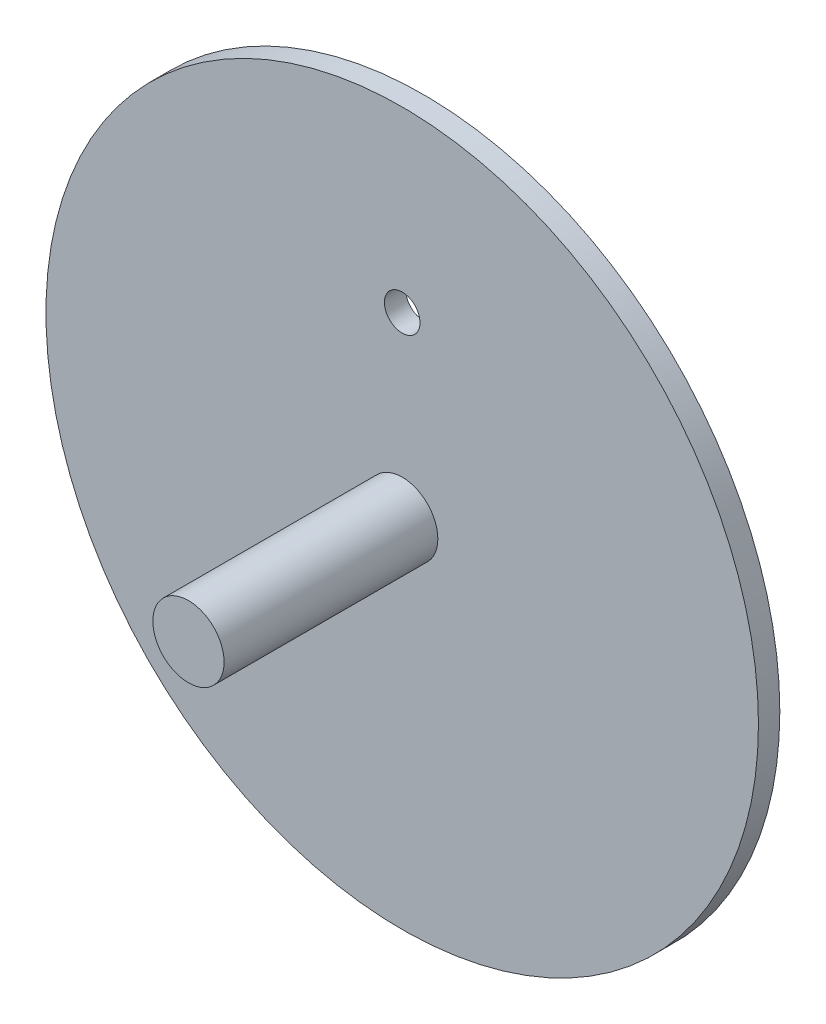
ISO-10303-21;
HEADER;
FILE_DESCRIPTION(('STEP AP214'),'2;1');
FILE_NAME('part.step','',(''),(''),'','','');
FILE_SCHEMA(('AUTOMOTIVE_DESIGN { 1 0 10303 214 1 1 1 1 }'));
ENDSEC;
DATA;
#1=APPLICATION_CONTEXT('core data for automotive mechanical design processes');
#2=APPLICATION_PROTOCOL_DEFINITION('international standard','automotive_design',2000,#1);
#3=PRODUCT_CONTEXT('',#1,'mechanical');
#4=PRODUCT('Part','Part','',(#3));
#5=PRODUCT_RELATED_PRODUCT_CATEGORY('part','',(#4));
#6=PRODUCT_DEFINITION_FORMATION('','',#4);
#7=PRODUCT_DEFINITION_CONTEXT('part definition',#1,'design');
#8=PRODUCT_DEFINITION('design','',#6,#7);
#9=PRODUCT_DEFINITION_SHAPE('','',#8);
#10=(LENGTH_UNIT() NAMED_UNIT(*) SI_UNIT(.MILLI.,.METRE.));
#11=(NAMED_UNIT(*) PLANE_ANGLE_UNIT() SI_UNIT($,.RADIAN.));
#12=(NAMED_UNIT(*) SI_UNIT($,.STERADIAN.) SOLID_ANGLE_UNIT());
#13=UNCERTAINTY_MEASURE_WITH_UNIT(LENGTH_MEASURE(1.E-05),#10,'distance_accuracy_value','');
#14=(GEOMETRIC_REPRESENTATION_CONTEXT(3) GLOBAL_UNCERTAINTY_ASSIGNED_CONTEXT((#13)) GLOBAL_UNIT_ASSIGNED_CONTEXT((#10,
#11,#12)) REPRESENTATION_CONTEXT('',''));
#15=CARTESIAN_POINT('',(0.,0.,0.));
#16=DIRECTION('',(0.,0.,1.));
#17=DIRECTION('',(1.,0.,0.));
#18=AXIS2_PLACEMENT_3D('',#15,#16,#17);
#19=CARTESIAN_POINT('',(0.,0.,3.));
#20=DIRECTION('',(0.,0.,-1.));
#21=DIRECTION('',(-1.,0.,0.));
#22=AXIS2_PLACEMENT_3D('',#19,#20,#21);
#23=CYLINDRICAL_SURFACE('',#22,50.);
#24=CARTESIAN_POINT('',(0.,0.,3.));
#25=DIRECTION('',(0.,0.,1.));
#26=DIRECTION('',(1.,0.,0.));
#27=AXIS2_PLACEMENT_3D('',#24,#25,#26);
#28=CIRCLE('',#27,50.);
#29=CARTESIAN_POINT('',(50.,0.,3.));
#30=VERTEX_POINT('',#29);
#31=EDGE_CURVE('E10',#30,#30,#28,.T.);
#32=ORIENTED_EDGE('',*,*,#31,.F.);
#33=EDGE_LOOP('',(#32));
#34=FACE_BOUND('',#33,.T.);
#35=CARTESIAN_POINT('',(0.,0.,0.));
#36=DIRECTION('',(0.,0.,1.));
#37=DIRECTION('',(1.,0.,0.));
#38=AXIS2_PLACEMENT_3D('',#35,#36,#37);
#39=CIRCLE('',#38,50.);
#40=CARTESIAN_POINT('',(50.,0.,0.));
#41=VERTEX_POINT('',#40);
#42=EDGE_CURVE('E36',#41,#41,#39,.T.);
#43=ORIENTED_EDGE('',*,*,#42,.T.);
#44=EDGE_LOOP('',(#43));
#45=FACE_BOUND('',#44,.T.);
#46=ADVANCED_FACE('F33',(#34,#45),#23,.T.);
#47=CARTESIAN_POINT('',(0.,0.,3.));
#48=DIRECTION('',(0.,0.,1.));
#49=DIRECTION('',(1.,0.,0.));
#50=AXIS2_PLACEMENT_3D('',#47,#48,#49);
#51=PLANE('',#50);
#52=CARTESIAN_POINT('',(0.,25.,3.));
#53=DIRECTION('',(0.,0.,1.));
#54=DIRECTION('',(1.,0.,0.));
#55=AXIS2_PLACEMENT_3D('',#52,#53,#54);
#56=CIRCLE('',#55,2.5);
#57=CARTESIAN_POINT('',(2.5,25.,3.));
#58=VERTEX_POINT('',#57);
#59=EDGE_CURVE('E51',#58,#58,#56,.T.);
#60=ORIENTED_EDGE('',*,*,#59,.F.);
#61=EDGE_LOOP('',(#60));
#62=FACE_BOUND('',#61,.T.);
#63=CARTESIAN_POINT('',(0.,0.,3.));
#64=DIRECTION('',(0.,0.,1.));
#65=DIRECTION('',(1.,0.,0.));
#66=AXIS2_PLACEMENT_3D('',#63,#64,#65);
#67=CIRCLE('',#66,5.);
#68=CARTESIAN_POINT('',(5.,0.,3.));
#69=VERTEX_POINT('',#68);
#70=EDGE_CURVE('E45',#69,#69,#67,.T.);
#71=ORIENTED_EDGE('',*,*,#70,.F.);
#72=EDGE_LOOP('',(#71));
#73=FACE_BOUND('',#72,.T.);
#74=ORIENTED_EDGE('',*,*,#31,.T.);
#75=EDGE_LOOP('',(#74));
#76=FACE_BOUND('',#75,.T.);
#77=ADVANCED_FACE('F67',(#62,#73,#76),#51,.T.);
#78=CARTESIAN_POINT('',(0.,0.,0.));
#79=DIRECTION('',(0.,0.,1.));
#80=DIRECTION('',(1.,0.,0.));
#81=AXIS2_PLACEMENT_3D('',#78,#79,#80);
#82=PLANE('',#81);
#83=CARTESIAN_POINT('',(0.,25.,0.));
#84=DIRECTION('',(0.,0.,1.));
#85=DIRECTION('',(1.,0.,0.));
#86=AXIS2_PLACEMENT_3D('',#83,#84,#85);
#87=CIRCLE('',#86,2.5);
#88=CARTESIAN_POINT('',(2.5,25.,0.));
#89=VERTEX_POINT('',#88);
#90=EDGE_CURVE('E48',#89,#89,#87,.T.);
#91=ORIENTED_EDGE('',*,*,#90,.T.);
#92=EDGE_LOOP('',(#91));
#93=FACE_BOUND('',#92,.T.);
#94=ORIENTED_EDGE('',*,*,#42,.F.);
#95=EDGE_LOOP('',(#94));
#96=FACE_BOUND('',#95,.T.);
#97=ADVANCED_FACE('F57',(#93,#96),#82,.F.);
#98=CARTESIAN_POINT('',(0.,0.,33.));
#99=DIRECTION('',(0.,0.,-1.));
#100=DIRECTION('',(-1.,0.,0.));
#101=AXIS2_PLACEMENT_3D('',#98,#99,#100);
#102=CYLINDRICAL_SURFACE('',#101,5.);
#103=CARTESIAN_POINT('',(0.,0.,33.));
#104=DIRECTION('',(0.,0.,1.));
#105=DIRECTION('',(1.,0.,0.));
#106=AXIS2_PLACEMENT_3D('',#103,#104,#105);
#107=CIRCLE('',#106,5.);
#108=CARTESIAN_POINT('',(5.,0.,33.));
#109=VERTEX_POINT('',#108);
#110=EDGE_CURVE('E43',#109,#109,#107,.T.);
#111=ORIENTED_EDGE('',*,*,#110,.F.);
#112=EDGE_LOOP('',(#111));
#113=FACE_BOUND('',#112,.T.);
#114=ORIENTED_EDGE('',*,*,#70,.T.);
#115=EDGE_LOOP('',(#114));
#116=FACE_BOUND('',#115,.T.);
#117=ADVANCED_FACE('F73',(#113,#116),#102,.T.);
#118=CARTESIAN_POINT('',(0.,0.,33.));
#119=DIRECTION('',(0.,0.,1.));
#120=DIRECTION('',(1.,0.,0.));
#121=AXIS2_PLACEMENT_3D('',#118,#119,#120);
#122=PLANE('',#121);
#123=ORIENTED_EDGE('',*,*,#110,.T.);
#124=EDGE_LOOP('',(#123));
#125=FACE_BOUND('',#124,.T.);
#126=ADVANCED_FACE('F63',(#125),#122,.T.);
#127=CARTESIAN_POINT('',(0.,25.,0.));
#128=DIRECTION('',(0.,0.,1.));
#129=DIRECTION('',(1.,0.,0.));
#130=AXIS2_PLACEMENT_3D('',#127,#128,#129);
#131=CYLINDRICAL_SURFACE('',#130,2.5);
#132=ORIENTED_EDGE('',*,*,#90,.F.);
#133=EDGE_LOOP('',(#132));
#134=FACE_BOUND('',#133,.T.);
#135=ORIENTED_EDGE('',*,*,#59,.T.);
#136=EDGE_LOOP('',(#135));
#137=FACE_BOUND('',#136,.T.);
#138=ADVANCED_FACE('F60',(#134,#137),#131,.F.);
#139=CLOSED_SHELL('',(#46,#77,#97,#117,#126,#138));
#140=MANIFOLD_SOLID_BREP('B2',#139);
#141=ADVANCED_BREP_SHAPE_REPRESENTATION('',(#18,#140),#14);
#142=SHAPE_DEFINITION_REPRESENTATION(#9,#141);
ENDSEC;
END-ISO-10303-21;
